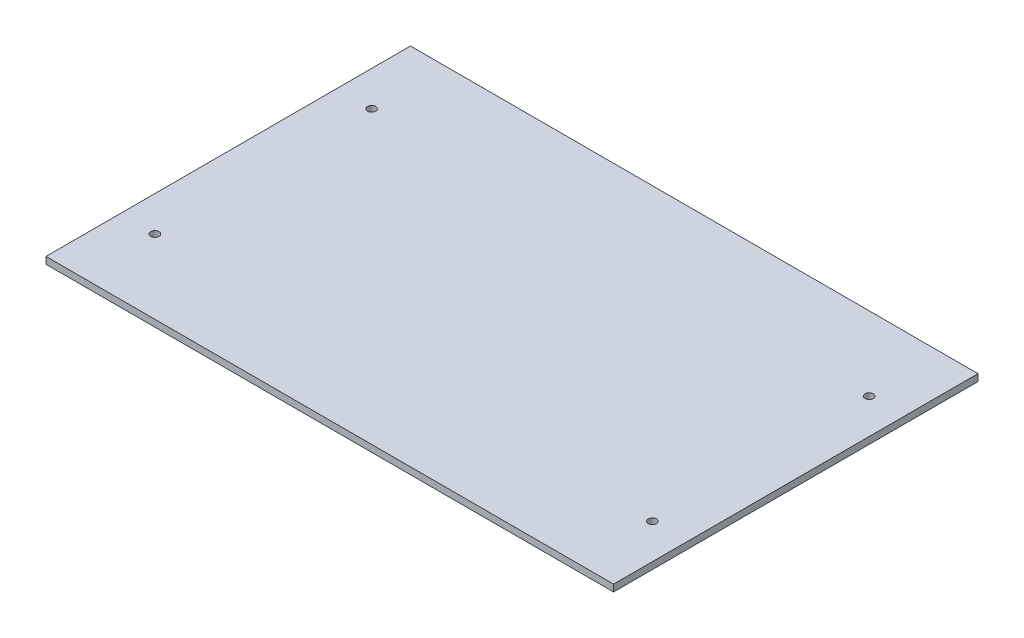
ISO-10303-21;
HEADER;
FILE_DESCRIPTION(('STEP AP214'),'2;1');
FILE_NAME('part.step','',(''),(''),'','','');
FILE_SCHEMA(('AUTOMOTIVE_DESIGN { 1 0 10303 214 1 1 1 1 }'));
ENDSEC;
DATA;
#1=APPLICATION_CONTEXT('core data for automotive mechanical design processes');
#2=APPLICATION_PROTOCOL_DEFINITION('international standard','automotive_design',2000,#1);
#3=PRODUCT_CONTEXT('',#1,'mechanical');
#4=PRODUCT('Part','Part','',(#3));
#5=PRODUCT_RELATED_PRODUCT_CATEGORY('part','',(#4));
#6=PRODUCT_DEFINITION_FORMATION('','',#4);
#7=PRODUCT_DEFINITION_CONTEXT('part definition',#1,'design');
#8=PRODUCT_DEFINITION('design','',#6,#7);
#9=PRODUCT_DEFINITION_SHAPE('','',#8);
#10=(LENGTH_UNIT() NAMED_UNIT(*) SI_UNIT(.MILLI.,.METRE.));
#11=(NAMED_UNIT(*) PLANE_ANGLE_UNIT() SI_UNIT($,.RADIAN.));
#12=(NAMED_UNIT(*) SI_UNIT($,.STERADIAN.) SOLID_ANGLE_UNIT());
#13=UNCERTAINTY_MEASURE_WITH_UNIT(LENGTH_MEASURE(1.E-05),#10,'distance_accuracy_value','');
#14=(GEOMETRIC_REPRESENTATION_CONTEXT(3) GLOBAL_UNCERTAINTY_ASSIGNED_CONTEXT((#13)) GLOBAL_UNIT_ASSIGNED_CONTEXT((#10,
#11,#12)) REPRESENTATION_CONTEXT('',''));
#15=CARTESIAN_POINT('',(0.,0.,0.));
#16=DIRECTION('',(0.,0.,1.));
#17=DIRECTION('',(1.,0.,0.));
#18=AXIS2_PLACEMENT_3D('',#15,#16,#17);
#19=CARTESIAN_POINT('',(0.,5.588,0.));
#20=DIRECTION('',(0.,-1.,0.));
#21=DIRECTION('',(0.,0.,-1.));
#22=AXIS2_PLACEMENT_3D('',#19,#20,#21);
#23=PLANE('',#22);
#24=DIRECTION('',(0.,0.,1.));
#25=VECTOR('',#24,1.);
#26=CARTESIAN_POINT('',(0.,5.588,0.));
#27=LINE('',#26,#25);
#28=CARTESIAN_POINT('',(0.,5.588,-297.688));
#29=VERTEX_POINT('',#28);
#30=CARTESIAN_POINT('',(0.,5.588,0.));
#31=VERTEX_POINT('',#30);
#32=EDGE_CURVE('E85',#29,#31,#27,.T.);
#33=ORIENTED_EDGE('',*,*,#32,.T.);
#34=DIRECTION('',(1.,0.,0.));
#35=VECTOR('',#34,1.);
#36=CARTESIAN_POINT('',(0.,5.588,0.));
#37=LINE('',#36,#35);
#38=CARTESIAN_POINT('',(463.55,5.588,0.));
#39=VERTEX_POINT('',#38);
#40=EDGE_CURVE('E80',#31,#39,#37,.T.);
#41=ORIENTED_EDGE('',*,*,#40,.T.);
#42=DIRECTION('',(0.,0.,-1.));
#43=VECTOR('',#42,1.);
#44=CARTESIAN_POINT('',(463.55,5.588,0.));
#45=LINE('',#44,#43);
#46=CARTESIAN_POINT('',(463.55,5.588,-297.688));
#47=VERTEX_POINT('',#46);
#48=EDGE_CURVE('E83',#39,#47,#45,.T.);
#49=ORIENTED_EDGE('',*,*,#48,.T.);
#50=DIRECTION('',(-1.,0.,0.));
#51=VECTOR('',#50,1.);
#52=CARTESIAN_POINT('',(0.,5.588,-297.688));
#53=LINE('',#52,#51);
#54=EDGE_CURVE('E50',#47,#29,#53,.T.);
#55=ORIENTED_EDGE('',*,*,#54,.T.);
#56=EDGE_LOOP('',(#33,#41,#49,#55));
#57=FACE_BOUND('',#56,.T.);
#58=CARTESIAN_POINT('',(28.575,5.588,-60.325));
#59=DIRECTION('',(0.,1.,0.));
#60=DIRECTION('',(0.,0.,1.));
#61=AXIS2_PLACEMENT_3D('',#58,#59,#60);
#62=CIRCLE('',#61,3.37820000000001);
#63=CARTESIAN_POINT('',(28.575,5.588,-56.9468));
#64=VERTEX_POINT('',#63);
#65=EDGE_CURVE('E100',#64,#64,#62,.T.);
#66=ORIENTED_EDGE('',*,*,#65,.F.);
#67=EDGE_LOOP('',(#66));
#68=FACE_BOUND('',#67,.T.);
#69=CARTESIAN_POINT('',(28.575,5.588,-237.363));
#70=DIRECTION('',(0.,1.,0.));
#71=DIRECTION('',(0.,0.,1.));
#72=AXIS2_PLACEMENT_3D('',#69,#70,#71);
#73=CIRCLE('',#72,3.37819999999999);
#74=CARTESIAN_POINT('',(28.575,5.588,-233.9848));
#75=VERTEX_POINT('',#74);
#76=EDGE_CURVE('E115',#75,#75,#73,.T.);
#77=ORIENTED_EDGE('',*,*,#76,.F.);
#78=EDGE_LOOP('',(#77));
#79=FACE_BOUND('',#78,.T.);
#80=CARTESIAN_POINT('',(434.975,5.588,-237.363));
#81=DIRECTION('',(0.,1.,0.));
#82=DIRECTION('',(0.,0.,-1.));
#83=AXIS2_PLACEMENT_3D('',#80,#81,#82);
#84=CIRCLE('',#83,3.37819999999999);
#85=CARTESIAN_POINT('',(434.975,5.588,-240.7412));
#86=VERTEX_POINT('',#85);
#87=EDGE_CURVE('E121',#86,#86,#84,.T.);
#88=ORIENTED_EDGE('',*,*,#87,.F.);
#89=EDGE_LOOP('',(#88));
#90=FACE_BOUND('',#89,.T.);
#91=CARTESIAN_POINT('',(434.975,5.588,-60.325));
#92=DIRECTION('',(0.,1.,0.));
#93=DIRECTION('',(0.,0.,-1.));
#94=AXIS2_PLACEMENT_3D('',#91,#92,#93);
#95=CIRCLE('',#94,3.37819999999999);
#96=CARTESIAN_POINT('',(434.975,5.588,-63.7032));
#97=VERTEX_POINT('',#96);
#98=EDGE_CURVE('E127',#97,#97,#95,.T.);
#99=ORIENTED_EDGE('',*,*,#98,.F.);
#100=EDGE_LOOP('',(#99));
#101=FACE_BOUND('',#100,.T.);
#102=ADVANCED_FACE('F33',(#57,#68,#79,#90,#101),#23,.F.);
#103=CARTESIAN_POINT('',(0.,0.,0.));
#104=DIRECTION('',(0.,-1.,0.));
#105=DIRECTION('',(0.,0.,-1.));
#106=AXIS2_PLACEMENT_3D('',#103,#104,#105);
#107=PLANE('',#106);
#108=CARTESIAN_POINT('',(434.975,0.,-237.363));
#109=DIRECTION('',(0.,1.,0.));
#110=DIRECTION('',(0.,0.,-1.));
#111=AXIS2_PLACEMENT_3D('',#108,#109,#110);
#112=CIRCLE('',#111,3.37819999999999);
#113=CARTESIAN_POINT('',(434.975,0.,-240.7412));
#114=VERTEX_POINT('',#113);
#115=EDGE_CURVE('E124',#114,#114,#112,.T.);
#116=ORIENTED_EDGE('',*,*,#115,.T.);
#117=EDGE_LOOP('',(#116));
#118=FACE_BOUND('',#117,.T.);
#119=CARTESIAN_POINT('',(28.575,0.,-60.325));
#120=DIRECTION('',(0.,1.,0.));
#121=DIRECTION('',(0.,0.,1.));
#122=AXIS2_PLACEMENT_3D('',#119,#120,#121);
#123=CIRCLE('',#122,3.37820000000001);
#124=CARTESIAN_POINT('',(28.575,0.,-56.9468));
#125=VERTEX_POINT('',#124);
#126=EDGE_CURVE('E112',#125,#125,#123,.T.);
#127=ORIENTED_EDGE('',*,*,#126,.T.);
#128=EDGE_LOOP('',(#127));
#129=FACE_BOUND('',#128,.T.);
#130=DIRECTION('',(0.,0.,1.));
#131=VECTOR('',#130,1.);
#132=CARTESIAN_POINT('',(0.,0.,0.));
#133=LINE('',#132,#131);
#134=CARTESIAN_POINT('',(0.,0.,-297.688));
#135=VERTEX_POINT('',#134);
#136=CARTESIAN_POINT('',(0.,0.,0.));
#137=VERTEX_POINT('',#136);
#138=EDGE_CURVE('E97',#135,#137,#133,.T.);
#139=ORIENTED_EDGE('',*,*,#138,.F.);
#140=DIRECTION('',(-1.,0.,0.));
#141=VECTOR('',#140,1.);
#142=CARTESIAN_POINT('',(0.,0.,-297.688));
#143=LINE('',#142,#141);
#144=CARTESIAN_POINT('',(463.55,0.,-297.688));
#145=VERTEX_POINT('',#144);
#146=EDGE_CURVE('E73',#145,#135,#143,.T.);
#147=ORIENTED_EDGE('',*,*,#146,.F.);
#148=DIRECTION('',(0.,0.,-1.));
#149=VECTOR('',#148,1.);
#150=CARTESIAN_POINT('',(463.55,0.,0.));
#151=LINE('',#150,#149);
#152=CARTESIAN_POINT('',(463.55,0.,0.));
#153=VERTEX_POINT('',#152);
#154=EDGE_CURVE('E67',#153,#145,#151,.T.);
#155=ORIENTED_EDGE('',*,*,#154,.F.);
#156=DIRECTION('',(1.,0.,0.));
#157=VECTOR('',#156,1.);
#158=CARTESIAN_POINT('',(0.,0.,0.));
#159=LINE('',#158,#157);
#160=EDGE_CURVE('E89',#137,#153,#159,.T.);
#161=ORIENTED_EDGE('',*,*,#160,.F.);
#162=EDGE_LOOP('',(#139,#147,#155,#161));
#163=FACE_BOUND('',#162,.T.);
#164=CARTESIAN_POINT('',(28.575,0.,-237.363));
#165=DIRECTION('',(0.,1.,0.));
#166=DIRECTION('',(0.,0.,1.));
#167=AXIS2_PLACEMENT_3D('',#164,#165,#166);
#168=CIRCLE('',#167,3.37819999999999);
#169=CARTESIAN_POINT('',(28.575,0.,-233.9848));
#170=VERTEX_POINT('',#169);
#171=EDGE_CURVE('E118',#170,#170,#168,.T.);
#172=ORIENTED_EDGE('',*,*,#171,.T.);
#173=EDGE_LOOP('',(#172));
#174=FACE_BOUND('',#173,.T.);
#175=CARTESIAN_POINT('',(434.975,0.,-60.325));
#176=DIRECTION('',(0.,1.,0.));
#177=DIRECTION('',(0.,0.,-1.));
#178=AXIS2_PLACEMENT_3D('',#175,#176,#177);
#179=CIRCLE('',#178,3.37819999999999);
#180=CARTESIAN_POINT('',(434.975,0.,-63.7032));
#181=VERTEX_POINT('',#180);
#182=EDGE_CURVE('E130',#181,#181,#179,.T.);
#183=ORIENTED_EDGE('',*,*,#182,.T.);
#184=EDGE_LOOP('',(#183));
#185=FACE_BOUND('',#184,.T.);
#186=ADVANCED_FACE('F108',(#118,#129,#163,#174,#185),#107,.T.);
#187=CARTESIAN_POINT('',(0.,5.588,0.));
#188=DIRECTION('',(1.,0.,0.));
#189=DIRECTION('',(0.,0.,-1.));
#190=AXIS2_PLACEMENT_3D('',#187,#188,#189);
#191=PLANE('',#190);
#192=ORIENTED_EDGE('',*,*,#138,.T.);
#193=DIRECTION('',(0.,-1.,0.));
#194=VECTOR('',#193,1.);
#195=CARTESIAN_POINT('',(0.,5.588,0.));
#196=LINE('',#195,#194);
#197=EDGE_CURVE('E11',#31,#137,#196,.T.);
#198=ORIENTED_EDGE('',*,*,#197,.F.);
#199=ORIENTED_EDGE('',*,*,#32,.F.);
#200=DIRECTION('',(0.,-1.,0.));
#201=VECTOR('',#200,1.);
#202=CARTESIAN_POINT('',(0.,5.588,-297.688));
#203=LINE('',#202,#201);
#204=EDGE_CURVE('E93',#29,#135,#203,.T.);
#205=ORIENTED_EDGE('',*,*,#204,.T.);
#206=EDGE_LOOP('',(#192,#198,#199,#205));
#207=FACE_BOUND('',#206,.T.);
#208=ADVANCED_FACE('F35',(#207),#191,.F.);
#209=CARTESIAN_POINT('',(0.,5.588,0.));
#210=DIRECTION('',(0.,0.,-1.));
#211=DIRECTION('',(-1.,0.,0.));
#212=AXIS2_PLACEMENT_3D('',#209,#210,#211);
#213=PLANE('',#212);
#214=ORIENTED_EDGE('',*,*,#160,.T.);
#215=DIRECTION('',(0.,-1.,0.));
#216=VECTOR('',#215,1.);
#217=CARTESIAN_POINT('',(463.55,5.588,0.));
#218=LINE('',#217,#216);
#219=EDGE_CURVE('E42',#39,#153,#218,.T.);
#220=ORIENTED_EDGE('',*,*,#219,.F.);
#221=ORIENTED_EDGE('',*,*,#40,.F.);
#222=ORIENTED_EDGE('',*,*,#197,.T.);
#223=EDGE_LOOP('',(#214,#220,#221,#222));
#224=FACE_BOUND('',#223,.T.);
#225=ADVANCED_FACE('F88',(#224),#213,.F.);
#226=CARTESIAN_POINT('',(463.55,5.588,0.));
#227=DIRECTION('',(-1.,0.,0.));
#228=DIRECTION('',(0.,0.,1.));
#229=AXIS2_PLACEMENT_3D('',#226,#227,#228);
#230=PLANE('',#229);
#231=ORIENTED_EDGE('',*,*,#154,.T.);
#232=DIRECTION('',(0.,-1.,0.));
#233=VECTOR('',#232,1.);
#234=CARTESIAN_POINT('',(463.55,5.588,-297.688));
#235=LINE('',#234,#233);
#236=EDGE_CURVE('E90',#47,#145,#235,.T.);
#237=ORIENTED_EDGE('',*,*,#236,.F.);
#238=ORIENTED_EDGE('',*,*,#48,.F.);
#239=ORIENTED_EDGE('',*,*,#219,.T.);
#240=EDGE_LOOP('',(#231,#237,#238,#239));
#241=FACE_BOUND('',#240,.T.);
#242=ADVANCED_FACE('F91',(#241),#230,.F.);
#243=CARTESIAN_POINT('',(0.,5.588,-297.688));
#244=DIRECTION('',(0.,0.,1.));
#245=DIRECTION('',(1.,0.,0.));
#246=AXIS2_PLACEMENT_3D('',#243,#244,#245);
#247=PLANE('',#246);
#248=ORIENTED_EDGE('',*,*,#146,.T.);
#249=ORIENTED_EDGE('',*,*,#204,.F.);
#250=ORIENTED_EDGE('',*,*,#54,.F.);
#251=ORIENTED_EDGE('',*,*,#236,.T.);
#252=EDGE_LOOP('',(#248,#249,#250,#251));
#253=FACE_BOUND('',#252,.T.);
#254=ADVANCED_FACE('F105',(#253),#247,.F.);
#255=CARTESIAN_POINT('',(28.575,5.588,-60.325));
#256=DIRECTION('',(0.,-1.,0.));
#257=DIRECTION('',(0.,0.,-1.));
#258=AXIS2_PLACEMENT_3D('',#255,#256,#257);
#259=CYLINDRICAL_SURFACE('',#258,3.37820000000001);
#260=ORIENTED_EDGE('',*,*,#65,.T.);
#261=EDGE_LOOP('',(#260));
#262=FACE_BOUND('',#261,.T.);
#263=ORIENTED_EDGE('',*,*,#126,.F.);
#264=EDGE_LOOP('',(#263));
#265=FACE_BOUND('',#264,.T.);
#266=ADVANCED_FACE('F147',(#262,#265),#259,.F.);
#267=CARTESIAN_POINT('',(28.575,5.588,-237.363));
#268=DIRECTION('',(0.,-1.,0.));
#269=DIRECTION('',(0.,0.,-1.));
#270=AXIS2_PLACEMENT_3D('',#267,#268,#269);
#271=CYLINDRICAL_SURFACE('',#270,3.37819999999999);
#272=ORIENTED_EDGE('',*,*,#76,.T.);
#273=EDGE_LOOP('',(#272));
#274=FACE_BOUND('',#273,.T.);
#275=ORIENTED_EDGE('',*,*,#171,.F.);
#276=EDGE_LOOP('',(#275));
#277=FACE_BOUND('',#276,.T.);
#278=ADVANCED_FACE('F193',(#274,#277),#271,.F.);
#279=CARTESIAN_POINT('',(434.975,5.588,-237.363));
#280=DIRECTION('',(0.,-1.,0.));
#281=DIRECTION('',(0.,0.,-1.));
#282=AXIS2_PLACEMENT_3D('',#279,#280,#281);
#283=CYLINDRICAL_SURFACE('',#282,3.37819999999999);
#284=ORIENTED_EDGE('',*,*,#87,.T.);
#285=EDGE_LOOP('',(#284));
#286=FACE_BOUND('',#285,.T.);
#287=ORIENTED_EDGE('',*,*,#115,.F.);
#288=EDGE_LOOP('',(#287));
#289=FACE_BOUND('',#288,.T.);
#290=ADVANCED_FACE('F201',(#286,#289),#283,.F.);
#291=CARTESIAN_POINT('',(434.975,5.588,-60.325));
#292=DIRECTION('',(0.,-1.,0.));
#293=DIRECTION('',(0.,0.,-1.));
#294=AXIS2_PLACEMENT_3D('',#291,#292,#293);
#295=CYLINDRICAL_SURFACE('',#294,3.37819999999999);
#296=ORIENTED_EDGE('',*,*,#98,.T.);
#297=EDGE_LOOP('',(#296));
#298=FACE_BOUND('',#297,.T.);
#299=ORIENTED_EDGE('',*,*,#182,.F.);
#300=EDGE_LOOP('',(#299));
#301=FACE_BOUND('',#300,.T.);
#302=ADVANCED_FACE('F136',(#298,#301),#295,.F.);
#303=CLOSED_SHELL('',(#102,#186,#208,#225,#242,#254,#266,#278,#290,#302));
#304=MANIFOLD_SOLID_BREP('B2',#303);
#305=ADVANCED_BREP_SHAPE_REPRESENTATION('',(#18,#304),#14);
#306=SHAPE_DEFINITION_REPRESENTATION(#9,#305);
ENDSEC;
END-ISO-10303-21;
